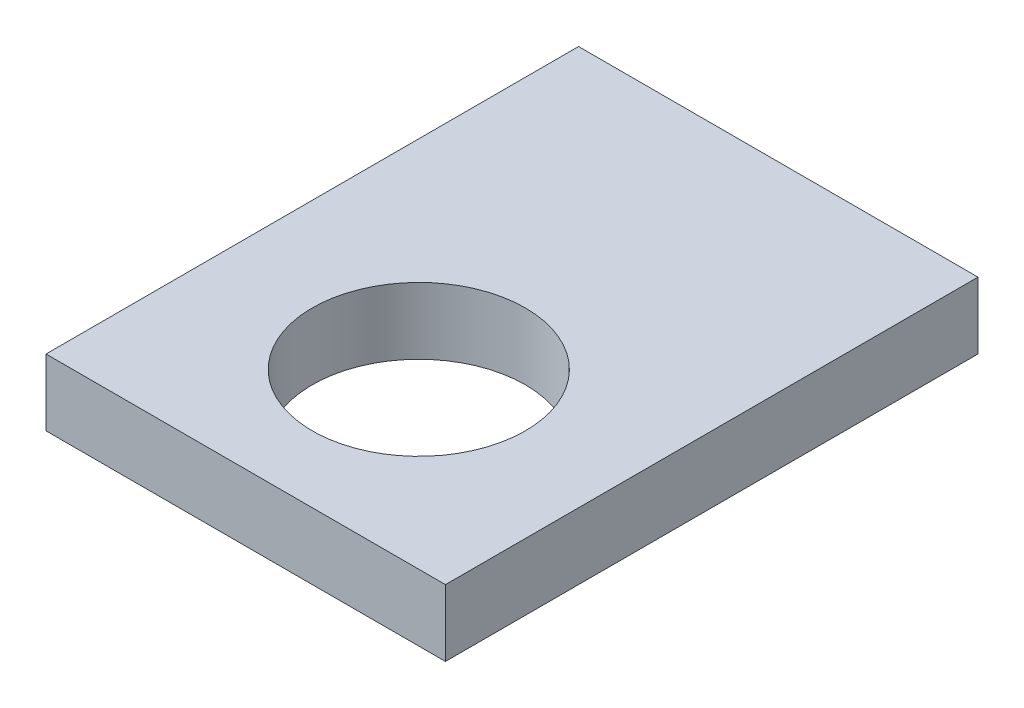
ISO-10303-21;
HEADER;
FILE_DESCRIPTION(('STEP AP214'),'2;1');
FILE_NAME('part.step','',(''),(''),'','','');
FILE_SCHEMA(('AUTOMOTIVE_DESIGN { 1 0 10303 214 1 1 1 1 }'));
ENDSEC;
DATA;
#1=APPLICATION_CONTEXT('core data for automotive mechanical design processes');
#2=APPLICATION_PROTOCOL_DEFINITION('international standard','automotive_design',2000,#1);
#3=PRODUCT_CONTEXT('',#1,'mechanical');
#4=PRODUCT('Part','Part','',(#3));
#5=PRODUCT_RELATED_PRODUCT_CATEGORY('part','',(#4));
#6=PRODUCT_DEFINITION_FORMATION('','',#4);
#7=PRODUCT_DEFINITION_CONTEXT('part definition',#1,'design');
#8=PRODUCT_DEFINITION('design','',#6,#7);
#9=PRODUCT_DEFINITION_SHAPE('','',#8);
#10=(LENGTH_UNIT() NAMED_UNIT(*) SI_UNIT(.MILLI.,.METRE.));
#11=(NAMED_UNIT(*) PLANE_ANGLE_UNIT() SI_UNIT($,.RADIAN.));
#12=(NAMED_UNIT(*) SI_UNIT($,.STERADIAN.) SOLID_ANGLE_UNIT());
#13=UNCERTAINTY_MEASURE_WITH_UNIT(LENGTH_MEASURE(1.E-05),#10,'distance_accuracy_value','');
#14=(GEOMETRIC_REPRESENTATION_CONTEXT(3) GLOBAL_UNCERTAINTY_ASSIGNED_CONTEXT((#13)) GLOBAL_UNIT_ASSIGNED_CONTEXT((#10,
#11,#12)) REPRESENTATION_CONTEXT('',''));
#15=CARTESIAN_POINT('',(0.,0.,0.));
#16=DIRECTION('',(0.,0.,1.));
#17=DIRECTION('',(1.,0.,0.));
#18=AXIS2_PLACEMENT_3D('',#15,#16,#17);
#19=CARTESIAN_POINT('',(0.,0.,40.));
#20=DIRECTION('',(1.,0.,0.));
#21=DIRECTION('',(0.,1.,0.));
#22=AXIS2_PLACEMENT_3D('',#19,#20,#21);
#23=PLANE('',#22);
#24=DIRECTION('',(0.,-1.,0.));
#25=VECTOR('',#24,1.);
#26=CARTESIAN_POINT('',(0.,0.,0.));
#27=LINE('',#26,#25);
#28=CARTESIAN_POINT('',(0.,5.,0.));
#29=VERTEX_POINT('',#28);
#30=CARTESIAN_POINT('',(0.,0.,0.));
#31=VERTEX_POINT('',#30);
#32=EDGE_CURVE('E96',#29,#31,#27,.T.);
#33=ORIENTED_EDGE('',*,*,#32,.T.);
#34=DIRECTION('',(0.,0.,-1.));
#35=VECTOR('',#34,1.);
#36=CARTESIAN_POINT('',(0.,0.,40.));
#37=LINE('',#36,#35);
#38=CARTESIAN_POINT('',(0.,0.,40.));
#39=VERTEX_POINT('',#38);
#40=EDGE_CURVE('E11',#39,#31,#37,.T.);
#41=ORIENTED_EDGE('',*,*,#40,.F.);
#42=DIRECTION('',(0.,-1.,0.));
#43=VECTOR('',#42,1.);
#44=CARTESIAN_POINT('',(0.,0.,40.));
#45=LINE('',#44,#43);
#46=CARTESIAN_POINT('',(0.,5.,40.));
#47=VERTEX_POINT('',#46);
#48=EDGE_CURVE('E84',#47,#39,#45,.T.);
#49=ORIENTED_EDGE('',*,*,#48,.F.);
#50=DIRECTION('',(0.,0.,-1.));
#51=VECTOR('',#50,1.);
#52=CARTESIAN_POINT('',(0.,5.,40.));
#53=LINE('',#52,#51);
#54=EDGE_CURVE('E92',#47,#29,#53,.T.);
#55=ORIENTED_EDGE('',*,*,#54,.T.);
#56=EDGE_LOOP('',(#33,#41,#49,#55));
#57=FACE_BOUND('',#56,.T.);
#58=ADVANCED_FACE('F33',(#57),#23,.F.);
#59=CARTESIAN_POINT('',(0.,0.,40.));
#60=DIRECTION('',(0.,1.,0.));
#61=DIRECTION('',(0.,0.,1.));
#62=AXIS2_PLACEMENT_3D('',#59,#60,#61);
#63=PLANE('',#62);
#64=CARTESIAN_POINT('',(15.,0.,27.));
#65=DIRECTION('',(0.,-1.,0.));
#66=DIRECTION('',(0.,0.,-1.));
#67=AXIS2_PLACEMENT_3D('',#64,#65,#66);
#68=CIRCLE('',#67,8.);
#69=CARTESIAN_POINT('',(15.,0.,19.));
#70=VERTEX_POINT('',#69);
#71=EDGE_CURVE('E110',#70,#70,#68,.T.);
#72=ORIENTED_EDGE('',*,*,#71,.F.);
#73=EDGE_LOOP('',(#72));
#74=FACE_BOUND('',#73,.T.);
#75=DIRECTION('',(1.,0.,0.));
#76=VECTOR('',#75,1.);
#77=CARTESIAN_POINT('',(0.,0.,0.));
#78=LINE('',#77,#76);
#79=CARTESIAN_POINT('',(30.,0.,0.));
#80=VERTEX_POINT('',#79);
#81=EDGE_CURVE('E88',#31,#80,#78,.T.);
#82=ORIENTED_EDGE('',*,*,#81,.T.);
#83=DIRECTION('',(0.,0.,-1.));
#84=VECTOR('',#83,1.);
#85=CARTESIAN_POINT('',(30.,0.,40.));
#86=LINE('',#85,#84);
#87=CARTESIAN_POINT('',(30.,0.,40.));
#88=VERTEX_POINT('',#87);
#89=EDGE_CURVE('E41',#88,#80,#86,.T.);
#90=ORIENTED_EDGE('',*,*,#89,.F.);
#91=DIRECTION('',(1.,0.,0.));
#92=VECTOR('',#91,1.);
#93=CARTESIAN_POINT('',(0.,0.,40.));
#94=LINE('',#93,#92);
#95=EDGE_CURVE('E79',#39,#88,#94,.T.);
#96=ORIENTED_EDGE('',*,*,#95,.F.);
#97=ORIENTED_EDGE('',*,*,#40,.T.);
#98=EDGE_LOOP('',(#82,#90,#96,#97));
#99=FACE_BOUND('',#98,.T.);
#100=ADVANCED_FACE('F87',(#74,#99),#63,.F.);
#101=CARTESIAN_POINT('',(30.,0.,40.));
#102=DIRECTION('',(-1.,0.,0.));
#103=DIRECTION('',(0.,-1.,0.));
#104=AXIS2_PLACEMENT_3D('',#101,#102,#103);
#105=PLANE('',#104);
#106=DIRECTION('',(0.,1.,0.));
#107=VECTOR('',#106,1.);
#108=CARTESIAN_POINT('',(30.,0.,0.));
#109=LINE('',#108,#107);
#110=CARTESIAN_POINT('',(30.,5.,0.));
#111=VERTEX_POINT('',#110);
#112=EDGE_CURVE('E66',#80,#111,#109,.T.);
#113=ORIENTED_EDGE('',*,*,#112,.T.);
#114=DIRECTION('',(0.,0.,-1.));
#115=VECTOR('',#114,1.);
#116=CARTESIAN_POINT('',(30.,5.,40.));
#117=LINE('',#116,#115);
#118=CARTESIAN_POINT('',(30.,5.,40.));
#119=VERTEX_POINT('',#118);
#120=EDGE_CURVE('E89',#119,#111,#117,.T.);
#121=ORIENTED_EDGE('',*,*,#120,.F.);
#122=DIRECTION('',(0.,1.,0.));
#123=VECTOR('',#122,1.);
#124=CARTESIAN_POINT('',(30.,0.,40.));
#125=LINE('',#124,#123);
#126=EDGE_CURVE('E82',#88,#119,#125,.T.);
#127=ORIENTED_EDGE('',*,*,#126,.F.);
#128=ORIENTED_EDGE('',*,*,#89,.T.);
#129=EDGE_LOOP('',(#113,#121,#127,#128));
#130=FACE_BOUND('',#129,.T.);
#131=ADVANCED_FACE('F90',(#130),#105,.F.);
#132=CARTESIAN_POINT('',(0.,5.,40.));
#133=DIRECTION('',(0.,-1.,0.));
#134=DIRECTION('',(0.,0.,-1.));
#135=AXIS2_PLACEMENT_3D('',#132,#133,#134);
#136=PLANE('',#135);
#137=CARTESIAN_POINT('',(15.,5.,27.));
#138=DIRECTION('',(0.,-1.,0.));
#139=DIRECTION('',(0.,0.,-1.));
#140=AXIS2_PLACEMENT_3D('',#137,#138,#139);
#141=CIRCLE('',#140,8.);
#142=CARTESIAN_POINT('',(15.,5.,19.));
#143=VERTEX_POINT('',#142);
#144=EDGE_CURVE('E99',#143,#143,#141,.T.);
#145=ORIENTED_EDGE('',*,*,#144,.T.);
#146=EDGE_LOOP('',(#145));
#147=FACE_BOUND('',#146,.T.);
#148=DIRECTION('',(-1.,0.,0.));
#149=VECTOR('',#148,1.);
#150=CARTESIAN_POINT('',(0.,5.,0.));
#151=LINE('',#150,#149);
#152=EDGE_CURVE('E72',#111,#29,#151,.T.);
#153=ORIENTED_EDGE('',*,*,#152,.T.);
#154=ORIENTED_EDGE('',*,*,#54,.F.);
#155=DIRECTION('',(-1.,0.,0.));
#156=VECTOR('',#155,1.);
#157=CARTESIAN_POINT('',(0.,5.,40.));
#158=LINE('',#157,#156);
#159=EDGE_CURVE('E49',#119,#47,#158,.T.);
#160=ORIENTED_EDGE('',*,*,#159,.F.);
#161=ORIENTED_EDGE('',*,*,#120,.T.);
#162=EDGE_LOOP('',(#153,#154,#160,#161));
#163=FACE_BOUND('',#162,.T.);
#164=ADVANCED_FACE('F104',(#147,#163),#136,.F.);
#165=CARTESIAN_POINT('',(0.,0.,40.));
#166=DIRECTION('',(0.,0.,-1.));
#167=DIRECTION('',(-1.,0.,0.));
#168=AXIS2_PLACEMENT_3D('',#165,#166,#167);
#169=PLANE('',#168);
#170=ORIENTED_EDGE('',*,*,#48,.T.);
#171=ORIENTED_EDGE('',*,*,#95,.T.);
#172=ORIENTED_EDGE('',*,*,#126,.T.);
#173=ORIENTED_EDGE('',*,*,#159,.T.);
#174=EDGE_LOOP('',(#170,#171,#172,#173));
#175=FACE_BOUND('',#174,.T.);
#176=ADVANCED_FACE('F80',(#175),#169,.F.);
#177=CARTESIAN_POINT('',(0.,0.,0.));
#178=DIRECTION('',(0.,0.,-1.));
#179=DIRECTION('',(-1.,0.,0.));
#180=AXIS2_PLACEMENT_3D('',#177,#178,#179);
#181=PLANE('',#180);
#182=ORIENTED_EDGE('',*,*,#32,.F.);
#183=ORIENTED_EDGE('',*,*,#152,.F.);
#184=ORIENTED_EDGE('',*,*,#112,.F.);
#185=ORIENTED_EDGE('',*,*,#81,.F.);
#186=EDGE_LOOP('',(#182,#183,#184,#185));
#187=FACE_BOUND('',#186,.T.);
#188=ADVANCED_FACE('F107',(#187),#181,.T.);
#189=CARTESIAN_POINT('',(15.,5.,27.));
#190=DIRECTION('',(0.,-1.,0.));
#191=DIRECTION('',(0.,0.,-1.));
#192=AXIS2_PLACEMENT_3D('',#189,#190,#191);
#193=CYLINDRICAL_SURFACE('',#192,8.);
#194=ORIENTED_EDGE('',*,*,#144,.F.);
#195=EDGE_LOOP('',(#194));
#196=FACE_BOUND('',#195,.T.);
#197=ORIENTED_EDGE('',*,*,#71,.T.);
#198=EDGE_LOOP('',(#197));
#199=FACE_BOUND('',#198,.T.);
#200=ADVANCED_FACE('F117',(#196,#199),#193,.F.);
#201=CLOSED_SHELL('',(#58,#100,#131,#164,#176,#188,#200));
#202=MANIFOLD_SOLID_BREP('B2',#201);
#203=ADVANCED_BREP_SHAPE_REPRESENTATION('',(#18,#202),#14);
#204=SHAPE_DEFINITION_REPRESENTATION(#9,#203);
ENDSEC;
END-ISO-10303-21;
